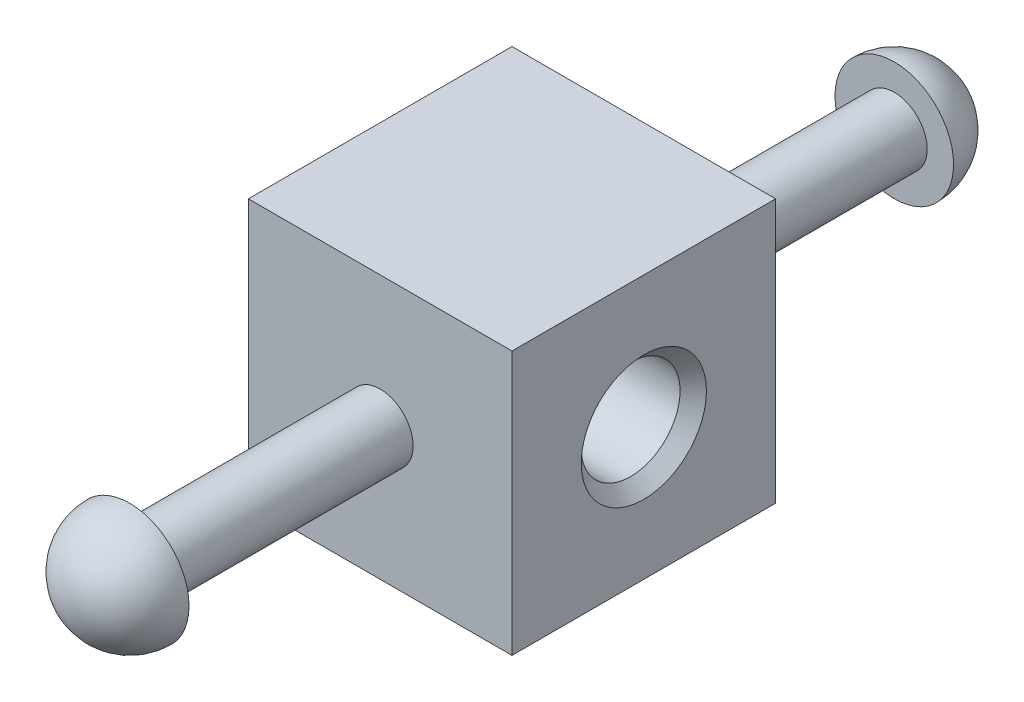
ISO-10303-21;
HEADER;
FILE_DESCRIPTION(('STEP AP214'),'2;1');
FILE_NAME('part.step','',(''),(''),'','','');
FILE_SCHEMA(('AUTOMOTIVE_DESIGN { 1 0 10303 214 1 1 1 1 }'));
ENDSEC;
DATA;
#1=APPLICATION_CONTEXT('core data for automotive mechanical design processes');
#2=APPLICATION_PROTOCOL_DEFINITION('international standard','automotive_design',2000,#1);
#3=PRODUCT_CONTEXT('',#1,'mechanical');
#4=PRODUCT('Part','Part','',(#3));
#5=PRODUCT_RELATED_PRODUCT_CATEGORY('part','',(#4));
#6=PRODUCT_DEFINITION_FORMATION('','',#4);
#7=PRODUCT_DEFINITION_CONTEXT('part definition',#1,'design');
#8=PRODUCT_DEFINITION('design','',#6,#7);
#9=PRODUCT_DEFINITION_SHAPE('','',#8);
#10=(LENGTH_UNIT() NAMED_UNIT(*) SI_UNIT(.MILLI.,.METRE.));
#11=(NAMED_UNIT(*) PLANE_ANGLE_UNIT() SI_UNIT($,.RADIAN.));
#12=(NAMED_UNIT(*) SI_UNIT($,.STERADIAN.) SOLID_ANGLE_UNIT());
#13=UNCERTAINTY_MEASURE_WITH_UNIT(LENGTH_MEASURE(1.E-05),#10,'distance_accuracy_value','');
#14=(GEOMETRIC_REPRESENTATION_CONTEXT(3) GLOBAL_UNCERTAINTY_ASSIGNED_CONTEXT((#13)) GLOBAL_UNIT_ASSIGNED_CONTEXT((#10,
#11,#12)) REPRESENTATION_CONTEXT('',''));
#15=CARTESIAN_POINT('',(0.,0.,0.));
#16=DIRECTION('',(0.,0.,1.));
#17=DIRECTION('',(1.,0.,0.));
#18=AXIS2_PLACEMENT_3D('',#15,#16,#17);
#19=CARTESIAN_POINT('',(12.7,0.,12.7));
#20=DIRECTION('',(0.,0.,1.));
#21=DIRECTION('',(0.,-1.,0.));
#22=AXIS2_PLACEMENT_3D('',#19,#20,#21);
#23=PLANE('',#22);
#24=CARTESIAN_POINT('',(0.,0.,12.7));
#25=DIRECTION('',(0.,0.,-1.));
#26=DIRECTION('',(0.,1.,0.));
#27=AXIS2_PLACEMENT_3D('',#24,#25,#26);
#28=CIRCLE('',#27,3.175);
#29=CARTESIAN_POINT('',(0.,3.175,12.7));
#30=VERTEX_POINT('',#29);
#31=EDGE_CURVE('E119',#30,#30,#28,.T.);
#32=ORIENTED_EDGE('',*,*,#31,.T.);
#33=EDGE_LOOP('',(#32));
#34=FACE_BOUND('',#33,.T.);
#35=DIRECTION('',(0.,1.,0.));
#36=VECTOR('',#35,1.);
#37=CARTESIAN_POINT('',(-12.7,0.,12.7));
#38=LINE('',#37,#36);
#39=CARTESIAN_POINT('',(-12.7,-12.7,12.7));
#40=VERTEX_POINT('',#39);
#41=CARTESIAN_POINT('',(-12.7,12.7,12.7));
#42=VERTEX_POINT('',#41);
#43=EDGE_CURVE('E117',#40,#42,#38,.T.);
#44=ORIENTED_EDGE('',*,*,#43,.F.);
#45=DIRECTION('',(-1.,0.,0.));
#46=VECTOR('',#45,1.);
#47=CARTESIAN_POINT('',(12.7,-12.7,12.7));
#48=LINE('',#47,#46);
#49=CARTESIAN_POINT('',(12.7,-12.7,12.7));
#50=VERTEX_POINT('',#49);
#51=EDGE_CURVE('E90',#50,#40,#48,.T.);
#52=ORIENTED_EDGE('',*,*,#51,.F.);
#53=DIRECTION('',(0.,1.,0.));
#54=VECTOR('',#53,1.);
#55=CARTESIAN_POINT('',(12.7,0.,12.7));
#56=LINE('',#55,#54);
#57=CARTESIAN_POINT('',(12.7,12.7,12.7));
#58=VERTEX_POINT('',#57);
#59=EDGE_CURVE('E111',#50,#58,#56,.T.);
#60=ORIENTED_EDGE('',*,*,#59,.T.);
#61=DIRECTION('',(-1.,0.,0.));
#62=VECTOR('',#61,1.);
#63=CARTESIAN_POINT('',(12.7,12.7,12.7));
#64=LINE('',#63,#62);
#65=EDGE_CURVE('E87',#58,#42,#64,.T.);
#66=ORIENTED_EDGE('',*,*,#65,.T.);
#67=EDGE_LOOP('',(#44,#52,#60,#66));
#68=FACE_BOUND('',#67,.T.);
#69=ADVANCED_FACE('F45',(#34,#68),#23,.T.);
#70=CARTESIAN_POINT('',(12.7,-12.7,0.));
#71=DIRECTION('',(0.,-1.,0.));
#72=DIRECTION('',(0.,0.,-1.));
#73=AXIS2_PLACEMENT_3D('',#70,#71,#72);
#74=PLANE('',#73);
#75=DIRECTION('',(0.,0.,1.));
#76=VECTOR('',#75,1.);
#77=CARTESIAN_POINT('',(-12.7,-12.7,0.));
#78=LINE('',#77,#76);
#79=CARTESIAN_POINT('',(-12.7,-12.7,-12.7));
#80=VERTEX_POINT('',#79);
#81=EDGE_CURVE('E101',#80,#40,#78,.T.);
#82=ORIENTED_EDGE('',*,*,#81,.F.);
#83=DIRECTION('',(-1.,0.,0.));
#84=VECTOR('',#83,1.);
#85=CARTESIAN_POINT('',(12.7,-12.7,-12.7));
#86=LINE('',#85,#84);
#87=CARTESIAN_POINT('',(12.7,-12.7,-12.7));
#88=VERTEX_POINT('',#87);
#89=EDGE_CURVE('E95',#88,#80,#86,.T.);
#90=ORIENTED_EDGE('',*,*,#89,.F.);
#91=DIRECTION('',(0.,0.,1.));
#92=VECTOR('',#91,1.);
#93=CARTESIAN_POINT('',(12.7,-12.7,0.));
#94=LINE('',#93,#92);
#95=EDGE_CURVE('E99',#88,#50,#94,.T.);
#96=ORIENTED_EDGE('',*,*,#95,.T.);
#97=ORIENTED_EDGE('',*,*,#51,.T.);
#98=EDGE_LOOP('',(#82,#90,#96,#97));
#99=FACE_BOUND('',#98,.T.);
#100=ADVANCED_FACE('F97',(#99),#74,.T.);
#101=CARTESIAN_POINT('',(12.7,0.,-12.7));
#102=DIRECTION('',(0.,0.,1.));
#103=DIRECTION('',(0.,-1.,0.));
#104=AXIS2_PLACEMENT_3D('',#101,#102,#103);
#105=PLANE('',#104);
#106=CARTESIAN_POINT('',(0.,0.,-12.7));
#107=DIRECTION('',(0.,0.,1.));
#108=DIRECTION('',(0.,-1.,0.));
#109=AXIS2_PLACEMENT_3D('',#106,#107,#108);
#110=CIRCLE('',#109,3.17500000000001);
#111=CARTESIAN_POINT('',(0.,-3.17500000000001,-12.7));
#112=VERTEX_POINT('',#111);
#113=EDGE_CURVE('E204',#112,#112,#110,.T.);
#114=ORIENTED_EDGE('',*,*,#113,.T.);
#115=EDGE_LOOP('',(#114));
#116=FACE_BOUND('',#115,.T.);
#117=DIRECTION('',(0.,1.,0.));
#118=VECTOR('',#117,1.);
#119=CARTESIAN_POINT('',(-12.7,0.,-12.7));
#120=LINE('',#119,#118);
#121=CARTESIAN_POINT('',(-12.7,12.7,-12.7));
#122=VERTEX_POINT('',#121);
#123=EDGE_CURVE('E121',#80,#122,#120,.T.);
#124=ORIENTED_EDGE('',*,*,#123,.T.);
#125=DIRECTION('',(-1.,0.,0.));
#126=VECTOR('',#125,1.);
#127=CARTESIAN_POINT('',(12.7,12.7,-12.7));
#128=LINE('',#127,#126);
#129=CARTESIAN_POINT('',(12.7,12.7,-12.7));
#130=VERTEX_POINT('',#129);
#131=EDGE_CURVE('E104',#130,#122,#128,.T.);
#132=ORIENTED_EDGE('',*,*,#131,.F.);
#133=DIRECTION('',(0.,1.,0.));
#134=VECTOR('',#133,1.);
#135=CARTESIAN_POINT('',(12.7,0.,-12.7));
#136=LINE('',#135,#134);
#137=EDGE_CURVE('E107',#88,#130,#136,.T.);
#138=ORIENTED_EDGE('',*,*,#137,.F.);
#139=ORIENTED_EDGE('',*,*,#89,.T.);
#140=EDGE_LOOP('',(#124,#132,#138,#139));
#141=FACE_BOUND('',#140,.T.);
#142=ADVANCED_FACE('F108',(#116,#141),#105,.F.);
#143=CARTESIAN_POINT('',(12.7,0.,0.));
#144=DIRECTION('',(-1.,0.,0.));
#145=DIRECTION('',(0.,0.,1.));
#146=AXIS2_PLACEMENT_3D('',#143,#144,#145);
#147=CYLINDRICAL_SURFACE('',#146,4.7625);
#148=CARTESIAN_POINT('',(-11.43,0.,0.));
#149=DIRECTION('',(1.,0.,0.));
#150=DIRECTION('',(0.,0.,-1.));
#151=AXIS2_PLACEMENT_3D('',#148,#149,#150);
#152=CIRCLE('',#151,4.7625);
#153=CARTESIAN_POINT('',(-11.43,0.,-4.7625));
#154=VERTEX_POINT('',#153);
#155=EDGE_CURVE('E55',#154,#154,#152,.F.);
#156=ORIENTED_EDGE('',*,*,#155,.T.);
#157=EDGE_LOOP('',(#156));
#158=FACE_BOUND('',#157,.T.);
#159=CARTESIAN_POINT('',(11.43,0.,0.));
#160=DIRECTION('',(1.,0.,0.));
#161=DIRECTION('',(0.,0.,-1.));
#162=AXIS2_PLACEMENT_3D('',#159,#160,#161);
#163=CIRCLE('',#162,4.7625);
#164=CARTESIAN_POINT('',(11.43,0.,-4.7625));
#165=VERTEX_POINT('',#164);
#166=EDGE_CURVE('E130',#165,#165,#163,.T.);
#167=ORIENTED_EDGE('',*,*,#166,.T.);
#168=EDGE_LOOP('',(#167));
#169=FACE_BOUND('',#168,.T.);
#170=ADVANCED_FACE('F135',(#158,#169),#147,.F.);
#171=CARTESIAN_POINT('',(12.7,12.7,0.));
#172=DIRECTION('',(0.,-1.,0.));
#173=DIRECTION('',(0.,0.,-1.));
#174=AXIS2_PLACEMENT_3D('',#171,#172,#173);
#175=PLANE('',#174);
#176=DIRECTION('',(0.,0.,1.));
#177=VECTOR('',#176,1.);
#178=CARTESIAN_POINT('',(-12.7,12.7,0.));
#179=LINE('',#178,#177);
#180=EDGE_CURVE('E80',#122,#42,#179,.T.);
#181=ORIENTED_EDGE('',*,*,#180,.T.);
#182=ORIENTED_EDGE('',*,*,#65,.F.);
#183=DIRECTION('',(0.,0.,1.));
#184=VECTOR('',#183,1.);
#185=CARTESIAN_POINT('',(12.7,12.7,0.));
#186=LINE('',#185,#184);
#187=EDGE_CURVE('E63',#130,#58,#186,.T.);
#188=ORIENTED_EDGE('',*,*,#187,.F.);
#189=ORIENTED_EDGE('',*,*,#131,.T.);
#190=EDGE_LOOP('',(#181,#182,#188,#189));
#191=FACE_BOUND('',#190,.T.);
#192=ADVANCED_FACE('F161',(#191),#175,.F.);
#193=CARTESIAN_POINT('',(12.7,0.,0.));
#194=DIRECTION('',(1.,0.,0.));
#195=DIRECTION('',(0.,0.,-1.));
#196=AXIS2_PLACEMENT_3D('',#193,#194,#195);
#197=PLANE('',#196);
#198=CARTESIAN_POINT('',(12.7,0.,0.));
#199=DIRECTION('',(1.,0.,0.));
#200=DIRECTION('',(0.,0.,-1.));
#201=AXIS2_PLACEMENT_3D('',#198,#199,#200);
#202=CIRCLE('',#201,6.0325);
#203=CARTESIAN_POINT('',(12.7,0.,-6.0325));
#204=VERTEX_POINT('',#203);
#205=EDGE_CURVE('E11',#204,#204,#202,.F.);
#206=ORIENTED_EDGE('',*,*,#205,.T.);
#207=EDGE_LOOP('',(#206));
#208=FACE_BOUND('',#207,.T.);
#209=ORIENTED_EDGE('',*,*,#59,.F.);
#210=ORIENTED_EDGE('',*,*,#95,.F.);
#211=ORIENTED_EDGE('',*,*,#137,.T.);
#212=ORIENTED_EDGE('',*,*,#187,.T.);
#213=EDGE_LOOP('',(#209,#210,#211,#212));
#214=FACE_BOUND('',#213,.T.);
#215=ADVANCED_FACE('F110',(#208,#214),#197,.T.);
#216=CARTESIAN_POINT('',(-12.7,0.,0.));
#217=DIRECTION('',(1.,0.,0.));
#218=DIRECTION('',(0.,0.,-1.));
#219=AXIS2_PLACEMENT_3D('',#216,#217,#218);
#220=PLANE('',#219);
#221=CARTESIAN_POINT('',(-12.7,0.,0.));
#222=DIRECTION('',(1.,0.,0.));
#223=DIRECTION('',(0.,0.,-1.));
#224=AXIS2_PLACEMENT_3D('',#221,#222,#223);
#225=CIRCLE('',#224,6.03250000000002);
#226=CARTESIAN_POINT('',(-12.7,0.,-6.03250000000002));
#227=VERTEX_POINT('',#226);
#228=EDGE_CURVE('E127',#227,#227,#225,.T.);
#229=ORIENTED_EDGE('',*,*,#228,.T.);
#230=EDGE_LOOP('',(#229));
#231=FACE_BOUND('',#230,.T.);
#232=ORIENTED_EDGE('',*,*,#43,.T.);
#233=ORIENTED_EDGE('',*,*,#180,.F.);
#234=ORIENTED_EDGE('',*,*,#123,.F.);
#235=ORIENTED_EDGE('',*,*,#81,.T.);
#236=EDGE_LOOP('',(#232,#233,#234,#235));
#237=FACE_BOUND('',#236,.T.);
#238=ADVANCED_FACE('F144',(#231,#237),#220,.F.);
#239=CARTESIAN_POINT('',(0.,0.,12.7));
#240=DIRECTION('',(0.,0.,-1.));
#241=DIRECTION('',(0.,1.,0.));
#242=AXIS2_PLACEMENT_3D('',#239,#240,#241);
#243=CYLINDRICAL_SURFACE('',#242,3.175);
#244=ORIENTED_EDGE('',*,*,#31,.F.);
#245=EDGE_LOOP('',(#244));
#246=FACE_BOUND('',#245,.T.);
#247=CARTESIAN_POINT('',(0.,0.,36.83));
#248=DIRECTION('',(0.,0.,-1.));
#249=DIRECTION('',(0.,1.,0.));
#250=AXIS2_PLACEMENT_3D('',#247,#248,#249);
#251=CIRCLE('',#250,3.175);
#252=CARTESIAN_POINT('',(0.,3.175,36.83));
#253=VERTEX_POINT('',#252);
#254=EDGE_CURVE('E218',#253,#253,#251,.T.);
#255=ORIENTED_EDGE('',*,*,#254,.T.);
#256=EDGE_LOOP('',(#255));
#257=FACE_BOUND('',#256,.T.);
#258=ADVANCED_FACE('F146',(#246,#257),#243,.T.);
#259=CARTESIAN_POINT('',(0.,0.,36.83));
#260=DIRECTION('',(0.,0.,-1.));
#261=DIRECTION('',(0.,1.,0.));
#262=AXIS2_PLACEMENT_3D('',#259,#260,#261);
#263=PLANE('',#262);
#264=CARTESIAN_POINT('',(0.,0.,36.83));
#265=DIRECTION('',(0.,0.,-1.));
#266=DIRECTION('',(0.,1.,0.));
#267=AXIS2_PLACEMENT_3D('',#264,#265,#266);
#268=CIRCLE('',#267,5.71232487796578);
#269=CARTESIAN_POINT('',(0.,5.71232487796578,36.83));
#270=VERTEX_POINT('',#269);
#271=EDGE_CURVE('E212',#270,#270,#268,.T.);
#272=ORIENTED_EDGE('',*,*,#271,.T.);
#273=EDGE_LOOP('',(#272));
#274=FACE_BOUND('',#273,.T.);
#275=ORIENTED_EDGE('',*,*,#254,.F.);
#276=EDGE_LOOP('',(#275));
#277=FACE_BOUND('',#276,.T.);
#278=ADVANCED_FACE('F184',(#274,#277),#263,.T.);
#279=CARTESIAN_POINT('',(0.,0.,36.83));
#280=DIRECTION('',(0.,0.,-1.));
#281=DIRECTION('',(0.,-1.,0.));
#282=AXIS2_PLACEMENT_3D('',#279,#280,#281);
#283=SPHERICAL_SURFACE('',#282,5.71232487796578);
#284=ORIENTED_EDGE('',*,*,#271,.F.);
#285=EDGE_LOOP('',(#284));
#286=FACE_BOUND('',#285,.T.);
#287=ADVANCED_FACE('F188',(#286),#283,.T.);
#288=CARTESIAN_POINT('',(0.,0.,-36.83));
#289=DIRECTION('',(0.,0.,1.));
#290=DIRECTION('',(0.,1.,0.));
#291=AXIS2_PLACEMENT_3D('',#288,#289,#290);
#292=SPHERICAL_SURFACE('',#291,5.71232487796578);
#293=CARTESIAN_POINT('',(0.,0.,-36.83));
#294=DIRECTION('',(0.,0.,1.));
#295=DIRECTION('',(0.,-1.,0.));
#296=AXIS2_PLACEMENT_3D('',#293,#294,#295);
#297=CIRCLE('',#296,5.71232487796578);
#298=CARTESIAN_POINT('',(0.,-5.71232487796577,-36.83));
#299=VERTEX_POINT('',#298);
#300=EDGE_CURVE('E209',#299,#299,#297,.T.);
#301=ORIENTED_EDGE('',*,*,#300,.F.);
#302=EDGE_LOOP('',(#301));
#303=FACE_BOUND('',#302,.T.);
#304=ADVANCED_FACE('F191',(#303),#292,.T.);
#305=CARTESIAN_POINT('',(0.,0.,-36.83));
#306=DIRECTION('',(0.,0.,1.));
#307=DIRECTION('',(0.,-1.,0.));
#308=AXIS2_PLACEMENT_3D('',#305,#306,#307);
#309=PLANE('',#308);
#310=ORIENTED_EDGE('',*,*,#300,.T.);
#311=EDGE_LOOP('',(#310));
#312=FACE_BOUND('',#311,.T.);
#313=CARTESIAN_POINT('',(0.,0.,-36.83));
#314=DIRECTION('',(0.,0.,1.));
#315=DIRECTION('',(0.,-1.,0.));
#316=AXIS2_PLACEMENT_3D('',#313,#314,#315);
#317=CIRCLE('',#316,3.175);
#318=CARTESIAN_POINT('',(0.,-3.17499999999999,-36.83));
#319=VERTEX_POINT('',#318);
#320=EDGE_CURVE('E207',#319,#319,#317,.T.);
#321=ORIENTED_EDGE('',*,*,#320,.F.);
#322=EDGE_LOOP('',(#321));
#323=FACE_BOUND('',#322,.T.);
#324=ADVANCED_FACE('F194',(#312,#323),#309,.T.);
#325=CARTESIAN_POINT('',(0.,0.,-12.7));
#326=DIRECTION('',(0.,0.,1.));
#327=DIRECTION('',(0.,-1.,0.));
#328=AXIS2_PLACEMENT_3D('',#325,#326,#327);
#329=CYLINDRICAL_SURFACE('',#328,3.175);
#330=ORIENTED_EDGE('',*,*,#113,.F.);
#331=EDGE_LOOP('',(#330));
#332=FACE_BOUND('',#331,.T.);
#333=ORIENTED_EDGE('',*,*,#320,.T.);
#334=EDGE_LOOP('',(#333));
#335=FACE_BOUND('',#334,.T.);
#336=ADVANCED_FACE('F141',(#332,#335),#329,.T.);
#337=CARTESIAN_POINT('',(-12.7,0.,0.));
#338=DIRECTION('',(-1.,0.,0.));
#339=DIRECTION('',(0.,0.,1.));
#340=AXIS2_PLACEMENT_3D('',#337,#338,#339);
#341=CONICAL_SURFACE('',#340,6.03250000000002,0.785398163397452);
#342=ORIENTED_EDGE('',*,*,#155,.F.);
#343=EDGE_LOOP('',(#342));
#344=FACE_BOUND('',#343,.T.);
#345=ORIENTED_EDGE('',*,*,#228,.F.);
#346=EDGE_LOOP('',(#345));
#347=FACE_BOUND('',#346,.T.);
#348=ADVANCED_FACE('F138',(#344,#347),#341,.F.);
#349=CARTESIAN_POINT('',(11.43,0.,0.));
#350=DIRECTION('',(1.,0.,0.));
#351=DIRECTION('',(0.,0.,-1.));
#352=AXIS2_PLACEMENT_3D('',#349,#350,#351);
#353=CONICAL_SURFACE('',#352,4.7625,0.78539816339745);
#354=ORIENTED_EDGE('',*,*,#205,.F.);
#355=EDGE_LOOP('',(#354));
#356=FACE_BOUND('',#355,.T.);
#357=ORIENTED_EDGE('',*,*,#166,.F.);
#358=EDGE_LOOP('',(#357));
#359=FACE_BOUND('',#358,.T.);
#360=ADVANCED_FACE('F48',(#356,#359),#353,.F.);
#361=CLOSED_SHELL('',(#69,#100,#142,#170,#192,#215,#238,#258,#278,#287,#304,#324,#336,#348,#360));
#362=MANIFOLD_SOLID_BREP('B2',#361);
#363=ADVANCED_BREP_SHAPE_REPRESENTATION('',(#18,#362),#14);
#364=SHAPE_DEFINITION_REPRESENTATION(#9,#363);
ENDSEC;
END-ISO-10303-21;
